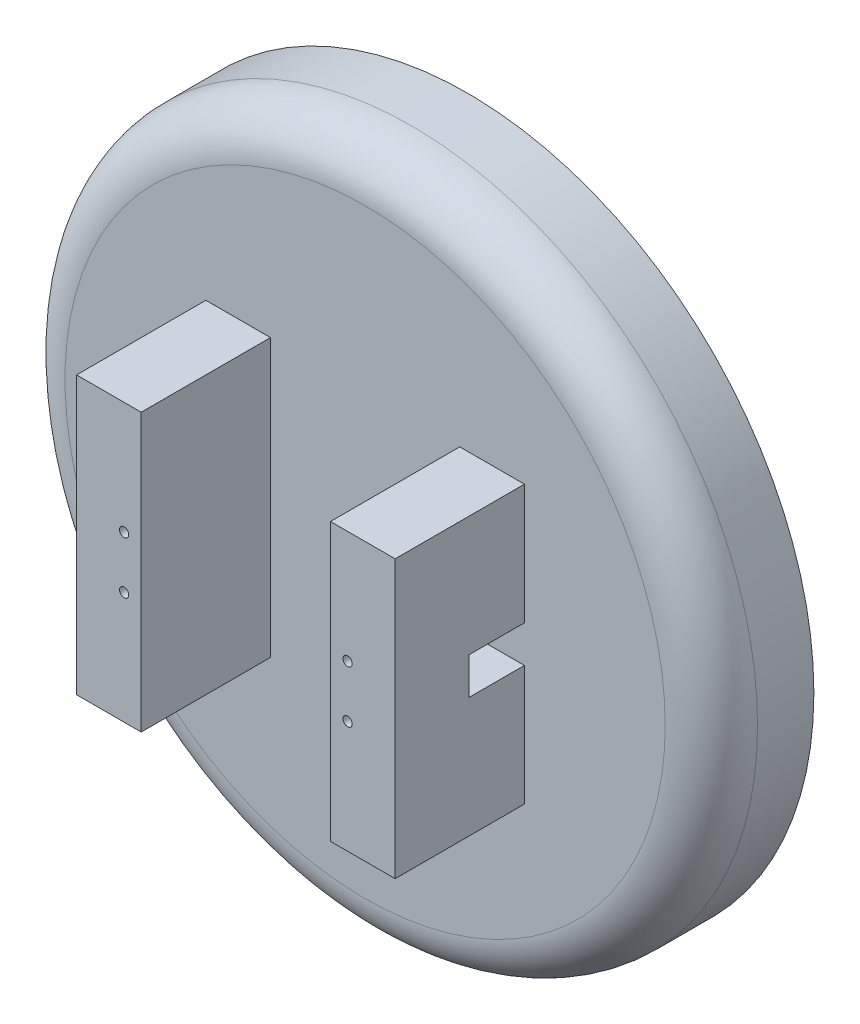
ISO-10303-21;
HEADER;
FILE_DESCRIPTION(('STEP AP214'),'2;1');
FILE_NAME('part.step','',(''),(''),'','','');
FILE_SCHEMA(('AUTOMOTIVE_DESIGN { 1 0 10303 214 1 1 1 1 }'));
ENDSEC;
DATA;
#1=APPLICATION_CONTEXT('core data for automotive mechanical design processes');
#2=APPLICATION_PROTOCOL_DEFINITION('international standard','automotive_design',2000,#1);
#3=PRODUCT_CONTEXT('',#1,'mechanical');
#4=PRODUCT('Part','Part','',(#3));
#5=PRODUCT_RELATED_PRODUCT_CATEGORY('part','',(#4));
#6=PRODUCT_DEFINITION_FORMATION('','',#4);
#7=PRODUCT_DEFINITION_CONTEXT('part definition',#1,'design');
#8=PRODUCT_DEFINITION('design','',#6,#7);
#9=PRODUCT_DEFINITION_SHAPE('','',#8);
#10=(LENGTH_UNIT() NAMED_UNIT(*) SI_UNIT(.MILLI.,.METRE.));
#11=(NAMED_UNIT(*) PLANE_ANGLE_UNIT() SI_UNIT($,.RADIAN.));
#12=(NAMED_UNIT(*) SI_UNIT($,.STERADIAN.) SOLID_ANGLE_UNIT());
#13=UNCERTAINTY_MEASURE_WITH_UNIT(LENGTH_MEASURE(1.E-05),#10,'distance_accuracy_value','');
#14=(GEOMETRIC_REPRESENTATION_CONTEXT(3) GLOBAL_UNCERTAINTY_ASSIGNED_CONTEXT((#13)) GLOBAL_UNIT_ASSIGNED_CONTEXT((#10,
#11,#12)) REPRESENTATION_CONTEXT('',''));
#15=CARTESIAN_POINT('',(0.,0.,0.));
#16=DIRECTION('',(0.,0.,1.));
#17=DIRECTION('',(1.,0.,0.));
#18=AXIS2_PLACEMENT_3D('',#15,#16,#17);
#19=CARTESIAN_POINT('',(34.5,30.,50.2));
#20=DIRECTION('',(-1.,0.,0.));
#21=DIRECTION('',(0.,-1.,0.));
#22=AXIS2_PLACEMENT_3D('',#19,#20,#21);
#23=PLANE('',#22);
#24=DIRECTION('',(0.,0.,1.));
#25=VECTOR('',#24,1.);
#26=CARTESIAN_POINT('',(34.5,4.,50.2));
#27=LINE('',#26,#25);
#28=CARTESIAN_POINT('',(34.5,4.,22.2));
#29=VERTEX_POINT('',#28);
#30=CARTESIAN_POINT('',(34.5,4.,34.2));
#31=VERTEX_POINT('',#30);
#32=EDGE_CURVE('E221',#29,#31,#27,.T.);
#33=ORIENTED_EDGE('',*,*,#32,.F.);
#34=DIRECTION('',(0.,1.,0.));
#35=VECTOR('',#34,1.);
#36=CARTESIAN_POINT('',(34.5,30.,22.2));
#37=LINE('',#36,#35);
#38=CARTESIAN_POINT('',(34.5,30.,22.2));
#39=VERTEX_POINT('',#38);
#40=EDGE_CURVE('E148',#29,#39,#37,.T.);
#41=ORIENTED_EDGE('',*,*,#40,.T.);
#42=DIRECTION('',(0.,0.,-1.));
#43=VECTOR('',#42,1.);
#44=CARTESIAN_POINT('',(34.5,30.,50.2));
#45=LINE('',#44,#43);
#46=CARTESIAN_POINT('',(34.5,30.,50.2));
#47=VERTEX_POINT('',#46);
#48=EDGE_CURVE('E166',#47,#39,#45,.T.);
#49=ORIENTED_EDGE('',*,*,#48,.F.);
#50=DIRECTION('',(0.,1.,0.));
#51=VECTOR('',#50,1.);
#52=CARTESIAN_POINT('',(34.5,30.,50.2));
#53=LINE('',#52,#51);
#54=CARTESIAN_POINT('',(34.5,-30.,50.2));
#55=VERTEX_POINT('',#54);
#56=EDGE_CURVE('E261',#55,#47,#53,.T.);
#57=ORIENTED_EDGE('',*,*,#56,.F.);
#58=DIRECTION('',(0.,0.,-1.));
#59=VECTOR('',#58,1.);
#60=CARTESIAN_POINT('',(34.5,-30.,50.2));
#61=LINE('',#60,#59);
#62=CARTESIAN_POINT('',(34.5,-30.,22.2));
#63=VERTEX_POINT('',#62);
#64=EDGE_CURVE('E145',#55,#63,#61,.T.);
#65=ORIENTED_EDGE('',*,*,#64,.T.);
#66=CARTESIAN_POINT('',(34.5,-4.,22.2));
#67=VERTEX_POINT('',#66);
#68=EDGE_CURVE('E140',#63,#67,#37,.T.);
#69=ORIENTED_EDGE('',*,*,#68,.T.);
#70=DIRECTION('',(0.,0.,-1.));
#71=VECTOR('',#70,1.);
#72=CARTESIAN_POINT('',(34.5,-4.,50.2));
#73=LINE('',#72,#71);
#74=CARTESIAN_POINT('',(34.5,-4.,34.2));
#75=VERTEX_POINT('',#74);
#76=EDGE_CURVE('E126',#75,#67,#73,.T.);
#77=ORIENTED_EDGE('',*,*,#76,.F.);
#78=DIRECTION('',(0.,-1.,0.));
#79=VECTOR('',#78,1.);
#80=CARTESIAN_POINT('',(34.5,30.,34.2));
#81=LINE('',#80,#79);
#82=EDGE_CURVE('E131',#31,#75,#81,.T.);
#83=ORIENTED_EDGE('',*,*,#82,.F.);
#84=EDGE_LOOP('',(#33,#41,#49,#57,#65,#69,#77,#83));
#85=FACE_BOUND('',#84,.T.);
#86=ADVANCED_FACE('F41',(#85),#23,.F.);
#87=CARTESIAN_POINT('',(20.5,30.,50.2));
#88=DIRECTION('',(1.,0.,0.));
#89=DIRECTION('',(0.,1.,0.));
#90=AXIS2_PLACEMENT_3D('',#87,#88,#89);
#91=PLANE('',#90);
#92=DIRECTION('',(0.,0.,-1.));
#93=VECTOR('',#92,1.);
#94=CARTESIAN_POINT('',(20.5,4.,50.2));
#95=LINE('',#94,#93);
#96=CARTESIAN_POINT('',(20.5,4.,34.2));
#97=VERTEX_POINT('',#96);
#98=CARTESIAN_POINT('',(20.5,4.,22.2));
#99=VERTEX_POINT('',#98);
#100=EDGE_CURVE('E11',#97,#99,#95,.T.);
#101=ORIENTED_EDGE('',*,*,#100,.F.);
#102=DIRECTION('',(0.,1.,0.));
#103=VECTOR('',#102,1.);
#104=CARTESIAN_POINT('',(20.5,30.,34.2));
#105=LINE('',#104,#103);
#106=CARTESIAN_POINT('',(20.5,-4.,34.2));
#107=VERTEX_POINT('',#106);
#108=EDGE_CURVE('E49',#107,#97,#105,.T.);
#109=ORIENTED_EDGE('',*,*,#108,.F.);
#110=DIRECTION('',(0.,0.,1.));
#111=VECTOR('',#110,1.);
#112=CARTESIAN_POINT('',(20.5,-4.,50.2));
#113=LINE('',#112,#111);
#114=CARTESIAN_POINT('',(20.5,-4.,22.2));
#115=VERTEX_POINT('',#114);
#116=EDGE_CURVE('E209',#115,#107,#113,.T.);
#117=ORIENTED_EDGE('',*,*,#116,.F.);
#118=DIRECTION('',(0.,-1.,0.));
#119=VECTOR('',#118,1.);
#120=CARTESIAN_POINT('',(20.5,30.,22.2));
#121=LINE('',#120,#119);
#122=CARTESIAN_POINT('',(20.5,-30.,22.2));
#123=VERTEX_POINT('',#122);
#124=EDGE_CURVE('E141',#115,#123,#121,.T.);
#125=ORIENTED_EDGE('',*,*,#124,.T.);
#126=DIRECTION('',(0.,0.,-1.));
#127=VECTOR('',#126,1.);
#128=CARTESIAN_POINT('',(20.5,-30.,50.2));
#129=LINE('',#128,#127);
#130=CARTESIAN_POINT('',(20.5,-30.,50.2));
#131=VERTEX_POINT('',#130);
#132=EDGE_CURVE('E160',#131,#123,#129,.T.);
#133=ORIENTED_EDGE('',*,*,#132,.F.);
#134=DIRECTION('',(0.,-1.,0.));
#135=VECTOR('',#134,1.);
#136=CARTESIAN_POINT('',(20.5,30.,50.2));
#137=LINE('',#136,#135);
#138=CARTESIAN_POINT('',(20.5,30.,50.2));
#139=VERTEX_POINT('',#138);
#140=EDGE_CURVE('E164',#139,#131,#137,.T.);
#141=ORIENTED_EDGE('',*,*,#140,.F.);
#142=DIRECTION('',(0.,0.,-1.));
#143=VECTOR('',#142,1.);
#144=CARTESIAN_POINT('',(20.5,30.,50.2));
#145=LINE('',#144,#143);
#146=CARTESIAN_POINT('',(20.5,30.,22.2));
#147=VERTEX_POINT('',#146);
#148=EDGE_CURVE('E163',#139,#147,#145,.T.);
#149=ORIENTED_EDGE('',*,*,#148,.T.);
#150=EDGE_CURVE('E156',#147,#99,#121,.T.);
#151=ORIENTED_EDGE('',*,*,#150,.T.);
#152=EDGE_LOOP('',(#101,#109,#117,#125,#133,#141,#149,#151));
#153=FACE_BOUND('',#152,.T.);
#154=ADVANCED_FACE('F223',(#153),#91,.F.);
#155=CARTESIAN_POINT('',(0.,0.,22.2));
#156=DIRECTION('',(0.,0.,1.));
#157=DIRECTION('',(1.,0.,0.));
#158=AXIS2_PLACEMENT_3D('',#155,#156,#157);
#159=PLANE('',#158);
#160=DIRECTION('',(-1.,0.,0.));
#161=VECTOR('',#160,1.);
#162=CARTESIAN_POINT('',(75.,4.,22.2));
#163=LINE('',#162,#161);
#164=EDGE_CURVE('E132',#29,#99,#163,.T.);
#165=ORIENTED_EDGE('',*,*,#164,.T.);
#166=ORIENTED_EDGE('',*,*,#150,.F.);
#167=DIRECTION('',(-1.,0.,0.));
#168=VECTOR('',#167,1.);
#169=CARTESIAN_POINT('',(20.5,30.,22.2));
#170=LINE('',#169,#168);
#171=EDGE_CURVE('E147',#39,#147,#170,.T.);
#172=ORIENTED_EDGE('',*,*,#171,.F.);
#173=ORIENTED_EDGE('',*,*,#40,.F.);
#174=EDGE_LOOP('',(#165,#166,#172,#173));
#175=FACE_BOUND('',#174,.T.);
#176=CARTESIAN_POINT('',(0.,0.,22.2));
#177=DIRECTION('',(0.,0.,1.));
#178=DIRECTION('',(1.,0.,0.));
#179=AXIS2_PLACEMENT_3D('',#176,#177,#178);
#180=CIRCLE('',#179,65.);
#181=CARTESIAN_POINT('',(65.,0.,22.2));
#182=VERTEX_POINT('',#181);
#183=EDGE_CURVE('E203',#182,#182,#180,.T.);
#184=ORIENTED_EDGE('',*,*,#183,.T.);
#185=EDGE_LOOP('',(#184));
#186=FACE_BOUND('',#185,.T.);
#187=DIRECTION('',(-1.,0.,0.));
#188=VECTOR('',#187,1.);
#189=CARTESIAN_POINT('',(75.,-4.,22.2));
#190=LINE('',#189,#188);
#191=EDGE_CURVE('E61',#67,#115,#190,.T.);
#192=ORIENTED_EDGE('',*,*,#191,.F.);
#193=ORIENTED_EDGE('',*,*,#68,.F.);
#194=DIRECTION('',(1.,0.,0.));
#195=VECTOR('',#194,1.);
#196=CARTESIAN_POINT('',(34.5,-30.,22.2));
#197=LINE('',#196,#195);
#198=EDGE_CURVE('E152',#123,#63,#197,.T.);
#199=ORIENTED_EDGE('',*,*,#198,.F.);
#200=ORIENTED_EDGE('',*,*,#124,.F.);
#201=EDGE_LOOP('',(#192,#193,#199,#200));
#202=FACE_BOUND('',#201,.T.);
#203=DIRECTION('',(0.,1.,0.));
#204=VECTOR('',#203,1.);
#205=CARTESIAN_POINT('',(-20.5,30.,22.2));
#206=LINE('',#205,#204);
#207=CARTESIAN_POINT('',(-20.5,-30.,22.2));
#208=VERTEX_POINT('',#207);
#209=CARTESIAN_POINT('',(-20.5,30.,22.2));
#210=VERTEX_POINT('',#209);
#211=EDGE_CURVE('E189',#208,#210,#206,.T.);
#212=ORIENTED_EDGE('',*,*,#211,.F.);
#213=DIRECTION('',(1.,0.,0.));
#214=VECTOR('',#213,1.);
#215=CARTESIAN_POINT('',(-34.5,-30.,22.2));
#216=LINE('',#215,#214);
#217=CARTESIAN_POINT('',(-34.5,-30.,22.2));
#218=VERTEX_POINT('',#217);
#219=EDGE_CURVE('E191',#218,#208,#216,.T.);
#220=ORIENTED_EDGE('',*,*,#219,.F.);
#221=DIRECTION('',(0.,-1.,0.));
#222=VECTOR('',#221,1.);
#223=CARTESIAN_POINT('',(-34.5,30.,22.2));
#224=LINE('',#223,#222);
#225=CARTESIAN_POINT('',(-34.5,30.,22.2));
#226=VERTEX_POINT('',#225);
#227=EDGE_CURVE('E183',#226,#218,#224,.T.);
#228=ORIENTED_EDGE('',*,*,#227,.F.);
#229=DIRECTION('',(-1.,0.,0.));
#230=VECTOR('',#229,1.);
#231=CARTESIAN_POINT('',(-34.5,30.,22.2));
#232=LINE('',#231,#230);
#233=EDGE_CURVE('E185',#210,#226,#232,.T.);
#234=ORIENTED_EDGE('',*,*,#233,.F.);
#235=EDGE_LOOP('',(#212,#220,#228,#234));
#236=FACE_BOUND('',#235,.T.);
#237=ADVANCED_FACE('F137',(#175,#186,#202,#236),#159,.T.);
#238=CARTESIAN_POINT('',(0.,0.,22.2));
#239=DIRECTION('',(0.,0.,-1.));
#240=DIRECTION('',(-1.,0.,0.));
#241=AXIS2_PLACEMENT_3D('',#238,#239,#240);
#242=CYLINDRICAL_SURFACE('',#241,75.);
#243=CARTESIAN_POINT('',(0.,0.,12.2));
#244=DIRECTION('',(0.,0.,1.));
#245=DIRECTION('',(1.,0.,0.));
#246=AXIS2_PLACEMENT_3D('',#243,#244,#245);
#247=CIRCLE('',#246,75.);
#248=CARTESIAN_POINT('',(75.,0.,12.2));
#249=VERTEX_POINT('',#248);
#250=EDGE_CURVE('E206',#249,#249,#247,.F.);
#251=ORIENTED_EDGE('',*,*,#250,.T.);
#252=EDGE_LOOP('',(#251));
#253=FACE_BOUND('',#252,.T.);
#254=CARTESIAN_POINT('',(0.,0.,0.));
#255=DIRECTION('',(0.,0.,1.));
#256=DIRECTION('',(1.,0.,0.));
#257=AXIS2_PLACEMENT_3D('',#254,#255,#256);
#258=CIRCLE('',#257,75.);
#259=CARTESIAN_POINT('',(75.,0.,0.));
#260=VERTEX_POINT('',#259);
#261=EDGE_CURVE('E170',#260,#260,#258,.T.);
#262=ORIENTED_EDGE('',*,*,#261,.T.);
#263=EDGE_LOOP('',(#262));
#264=FACE_BOUND('',#263,.T.);
#265=ADVANCED_FACE('F362',(#253,#264),#242,.T.);
#266=CARTESIAN_POINT('',(0.,0.,0.));
#267=DIRECTION('',(0.,0.,1.));
#268=DIRECTION('',(1.,0.,0.));
#269=AXIS2_PLACEMENT_3D('',#266,#267,#268);
#270=PLANE('',#269);
#271=ORIENTED_EDGE('',*,*,#261,.F.);
#272=EDGE_LOOP('',(#271));
#273=FACE_BOUND('',#272,.T.);
#274=ADVANCED_FACE('F354',(#273),#270,.F.);
#275=CARTESIAN_POINT('',(0.,0.,12.2));
#276=DIRECTION('',(0.,0.,1.));
#277=DIRECTION('',(1.,0.,0.));
#278=AXIS2_PLACEMENT_3D('',#275,#276,#277);
#279=TOROIDAL_SURFACE('',#278,65.,10.);
#280=ORIENTED_EDGE('',*,*,#250,.F.);
#281=EDGE_LOOP('',(#280));
#282=FACE_BOUND('',#281,.T.);
#283=ORIENTED_EDGE('',*,*,#183,.F.);
#284=EDGE_LOOP('',(#283));
#285=FACE_BOUND('',#284,.T.);
#286=ADVANCED_FACE('F43',(#282,#285),#279,.T.);
#287=CARTESIAN_POINT('',(-34.5,-30.,50.2));
#288=DIRECTION('',(0.,1.,0.));
#289=DIRECTION('',(0.,0.,1.));
#290=AXIS2_PLACEMENT_3D('',#287,#288,#289);
#291=PLANE('',#290);
#292=ORIENTED_EDGE('',*,*,#219,.T.);
#293=DIRECTION('',(0.,0.,-1.));
#294=VECTOR('',#293,1.);
#295=CARTESIAN_POINT('',(-20.5,-30.,50.2));
#296=LINE('',#295,#294);
#297=CARTESIAN_POINT('',(-20.5,-30.,50.2));
#298=VERTEX_POINT('',#297);
#299=EDGE_CURVE('E171',#298,#208,#296,.T.);
#300=ORIENTED_EDGE('',*,*,#299,.F.);
#301=DIRECTION('',(1.,0.,0.));
#302=VECTOR('',#301,1.);
#303=CARTESIAN_POINT('',(-34.5,-30.,50.2));
#304=LINE('',#303,#302);
#305=CARTESIAN_POINT('',(-34.5,-30.,50.2));
#306=VERTEX_POINT('',#305);
#307=EDGE_CURVE('E186',#306,#298,#304,.T.);
#308=ORIENTED_EDGE('',*,*,#307,.F.);
#309=DIRECTION('',(0.,0.,-1.));
#310=VECTOR('',#309,1.);
#311=CARTESIAN_POINT('',(-34.5,-30.,50.2));
#312=LINE('',#311,#310);
#313=EDGE_CURVE('E179',#306,#218,#312,.T.);
#314=ORIENTED_EDGE('',*,*,#313,.T.);
#315=EDGE_LOOP('',(#292,#300,#308,#314));
#316=FACE_BOUND('',#315,.T.);
#317=ADVANCED_FACE('F353',(#316),#291,.F.);
#318=CARTESIAN_POINT('',(-20.5,30.,50.2));
#319=DIRECTION('',(-1.,0.,0.));
#320=DIRECTION('',(0.,-1.,0.));
#321=AXIS2_PLACEMENT_3D('',#318,#319,#320);
#322=PLANE('',#321);
#323=ORIENTED_EDGE('',*,*,#211,.T.);
#324=DIRECTION('',(0.,0.,-1.));
#325=VECTOR('',#324,1.);
#326=CARTESIAN_POINT('',(-20.5,30.,50.2));
#327=LINE('',#326,#325);
#328=CARTESIAN_POINT('',(-20.5,30.,50.2));
#329=VERTEX_POINT('',#328);
#330=EDGE_CURVE('E173',#329,#210,#327,.T.);
#331=ORIENTED_EDGE('',*,*,#330,.F.);
#332=DIRECTION('',(0.,1.,0.));
#333=VECTOR('',#332,1.);
#334=CARTESIAN_POINT('',(-20.5,30.,50.2));
#335=LINE('',#334,#333);
#336=EDGE_CURVE('E197',#298,#329,#335,.T.);
#337=ORIENTED_EDGE('',*,*,#336,.F.);
#338=ORIENTED_EDGE('',*,*,#299,.T.);
#339=EDGE_LOOP('',(#323,#331,#337,#338));
#340=FACE_BOUND('',#339,.T.);
#341=ADVANCED_FACE('F451',(#340),#322,.F.);
#342=CARTESIAN_POINT('',(-34.5,30.,50.2));
#343=DIRECTION('',(0.,-1.,0.));
#344=DIRECTION('',(0.,0.,-1.));
#345=AXIS2_PLACEMENT_3D('',#342,#343,#344);
#346=PLANE('',#345);
#347=ORIENTED_EDGE('',*,*,#233,.T.);
#348=DIRECTION('',(0.,0.,-1.));
#349=VECTOR('',#348,1.);
#350=CARTESIAN_POINT('',(-34.5,30.,50.2));
#351=LINE('',#350,#349);
#352=CARTESIAN_POINT('',(-34.5,30.,50.2));
#353=VERTEX_POINT('',#352);
#354=EDGE_CURVE('E177',#353,#226,#351,.T.);
#355=ORIENTED_EDGE('',*,*,#354,.F.);
#356=DIRECTION('',(-1.,0.,0.));
#357=VECTOR('',#356,1.);
#358=CARTESIAN_POINT('',(-34.5,30.,50.2));
#359=LINE('',#358,#357);
#360=EDGE_CURVE('E195',#329,#353,#359,.T.);
#361=ORIENTED_EDGE('',*,*,#360,.F.);
#362=ORIENTED_EDGE('',*,*,#330,.T.);
#363=EDGE_LOOP('',(#347,#355,#361,#362));
#364=FACE_BOUND('',#363,.T.);
#365=ADVANCED_FACE('F442',(#364),#346,.F.);
#366=CARTESIAN_POINT('',(-34.5,30.,50.2));
#367=DIRECTION('',(1.,0.,0.));
#368=DIRECTION('',(0.,1.,0.));
#369=AXIS2_PLACEMENT_3D('',#366,#367,#368);
#370=PLANE('',#369);
#371=ORIENTED_EDGE('',*,*,#227,.T.);
#372=ORIENTED_EDGE('',*,*,#313,.F.);
#373=DIRECTION('',(0.,-1.,0.));
#374=VECTOR('',#373,1.);
#375=CARTESIAN_POINT('',(-34.5,30.,50.2));
#376=LINE('',#375,#374);
#377=EDGE_CURVE('E182',#353,#306,#376,.T.);
#378=ORIENTED_EDGE('',*,*,#377,.F.);
#379=ORIENTED_EDGE('',*,*,#354,.T.);
#380=EDGE_LOOP('',(#371,#372,#378,#379));
#381=FACE_BOUND('',#380,.T.);
#382=ADVANCED_FACE('F282',(#381),#370,.F.);
#383=CARTESIAN_POINT('',(0.,0.,50.2));
#384=DIRECTION('',(0.,0.,-1.));
#385=DIRECTION('',(-1.,0.,0.));
#386=AXIS2_PLACEMENT_3D('',#383,#384,#385);
#387=PLANE('',#386);
#388=CARTESIAN_POINT('',(-24.2,-5.65,50.2));
#389=DIRECTION('',(0.,0.,1.));
#390=DIRECTION('',(-1.,0.,0.));
#391=AXIS2_PLACEMENT_3D('',#388,#389,#390);
#392=CIRCLE('',#391,1.);
#393=CARTESIAN_POINT('',(-25.2,-5.65,50.2));
#394=VERTEX_POINT('',#393);
#395=EDGE_CURVE('E237',#394,#394,#392,.T.);
#396=ORIENTED_EDGE('',*,*,#395,.F.);
#397=EDGE_LOOP('',(#396));
#398=FACE_BOUND('',#397,.T.);
#399=CARTESIAN_POINT('',(-24.2,5.65,50.2));
#400=DIRECTION('',(0.,0.,1.));
#401=DIRECTION('',(1.,0.,0.));
#402=AXIS2_PLACEMENT_3D('',#399,#400,#401);
#403=CIRCLE('',#402,1.);
#404=CARTESIAN_POINT('',(-23.2,5.65,50.2));
#405=VERTEX_POINT('',#404);
#406=EDGE_CURVE('E240',#405,#405,#403,.T.);
#407=ORIENTED_EDGE('',*,*,#406,.F.);
#408=EDGE_LOOP('',(#407));
#409=FACE_BOUND('',#408,.T.);
#410=ORIENTED_EDGE('',*,*,#307,.T.);
#411=ORIENTED_EDGE('',*,*,#336,.T.);
#412=ORIENTED_EDGE('',*,*,#360,.T.);
#413=ORIENTED_EDGE('',*,*,#377,.T.);
#414=EDGE_LOOP('',(#410,#411,#412,#413));
#415=FACE_BOUND('',#414,.T.);
#416=ADVANCED_FACE('F273',(#398,#409,#415),#387,.F.);
#417=CARTESIAN_POINT('',(34.5,-30.,50.2));
#418=DIRECTION('',(0.,1.,0.));
#419=DIRECTION('',(0.,0.,1.));
#420=AXIS2_PLACEMENT_3D('',#417,#418,#419);
#421=PLANE('',#420);
#422=ORIENTED_EDGE('',*,*,#198,.T.);
#423=ORIENTED_EDGE('',*,*,#64,.F.);
#424=DIRECTION('',(1.,0.,0.));
#425=VECTOR('',#424,1.);
#426=CARTESIAN_POINT('',(34.5,-30.,50.2));
#427=LINE('',#426,#425);
#428=EDGE_CURVE('E159',#131,#55,#427,.T.);
#429=ORIENTED_EDGE('',*,*,#428,.F.);
#430=ORIENTED_EDGE('',*,*,#132,.T.);
#431=EDGE_LOOP('',(#422,#423,#429,#430));
#432=FACE_BOUND('',#431,.T.);
#433=ADVANCED_FACE('F270',(#432),#421,.F.);
#434=CARTESIAN_POINT('',(20.5,30.,50.2));
#435=DIRECTION('',(0.,-1.,0.));
#436=DIRECTION('',(0.,0.,-1.));
#437=AXIS2_PLACEMENT_3D('',#434,#435,#436);
#438=PLANE('',#437);
#439=ORIENTED_EDGE('',*,*,#171,.T.);
#440=ORIENTED_EDGE('',*,*,#148,.F.);
#441=DIRECTION('',(-1.,0.,0.));
#442=VECTOR('',#441,1.);
#443=CARTESIAN_POINT('',(20.5,30.,50.2));
#444=LINE('',#443,#442);
#445=EDGE_CURVE('E263',#47,#139,#444,.T.);
#446=ORIENTED_EDGE('',*,*,#445,.F.);
#447=ORIENTED_EDGE('',*,*,#48,.T.);
#448=EDGE_LOOP('',(#439,#440,#446,#447));
#449=FACE_BOUND('',#448,.T.);
#450=ADVANCED_FACE('F272',(#449),#438,.F.);
#451=CARTESIAN_POINT('',(0.,0.,50.2));
#452=DIRECTION('',(0.,0.,1.));
#453=DIRECTION('',(1.,0.,0.));
#454=AXIS2_PLACEMENT_3D('',#451,#452,#453);
#455=PLANE('',#454);
#456=CARTESIAN_POINT('',(24.2,5.64999999999999,50.2));
#457=DIRECTION('',(0.,0.,1.));
#458=DIRECTION('',(-1.,0.,0.));
#459=AXIS2_PLACEMENT_3D('',#456,#457,#458);
#460=CIRCLE('',#459,1.);
#461=CARTESIAN_POINT('',(23.2,5.64999999999999,50.2));
#462=VERTEX_POINT('',#461);
#463=EDGE_CURVE('E250',#462,#462,#460,.T.);
#464=ORIENTED_EDGE('',*,*,#463,.F.);
#465=EDGE_LOOP('',(#464));
#466=FACE_BOUND('',#465,.T.);
#467=CARTESIAN_POINT('',(24.2,-5.65,50.2));
#468=DIRECTION('',(0.,0.,1.));
#469=DIRECTION('',(1.,0.,0.));
#470=AXIS2_PLACEMENT_3D('',#467,#468,#469);
#471=CIRCLE('',#470,1.);
#472=CARTESIAN_POINT('',(25.2,-5.65,50.2));
#473=VERTEX_POINT('',#472);
#474=EDGE_CURVE('E244',#473,#473,#471,.T.);
#475=ORIENTED_EDGE('',*,*,#474,.F.);
#476=EDGE_LOOP('',(#475));
#477=FACE_BOUND('',#476,.T.);
#478=ORIENTED_EDGE('',*,*,#428,.T.);
#479=ORIENTED_EDGE('',*,*,#56,.T.);
#480=ORIENTED_EDGE('',*,*,#445,.T.);
#481=ORIENTED_EDGE('',*,*,#140,.T.);
#482=EDGE_LOOP('',(#478,#479,#480,#481));
#483=FACE_BOUND('',#482,.T.);
#484=ADVANCED_FACE('F266',(#466,#477,#483),#455,.T.);
#485=CARTESIAN_POINT('',(24.2,-5.65,40.2));
#486=DIRECTION('',(0.,0.,1.));
#487=DIRECTION('',(1.,0.,0.));
#488=AXIS2_PLACEMENT_3D('',#485,#486,#487);
#489=CYLINDRICAL_SURFACE('',#488,1.);
#490=CARTESIAN_POINT('',(24.2,-5.65,40.2));
#491=DIRECTION('',(0.,0.,1.));
#492=DIRECTION('',(1.,0.,0.));
#493=AXIS2_PLACEMENT_3D('',#490,#491,#492);
#494=CIRCLE('',#493,1.);
#495=CARTESIAN_POINT('',(25.2,-5.65,40.2));
#496=VERTEX_POINT('',#495);
#497=EDGE_CURVE('E247',#496,#496,#494,.T.);
#498=ORIENTED_EDGE('',*,*,#497,.F.);
#499=EDGE_LOOP('',(#498));
#500=FACE_BOUND('',#499,.T.);
#501=ORIENTED_EDGE('',*,*,#474,.T.);
#502=EDGE_LOOP('',(#501));
#503=FACE_BOUND('',#502,.T.);
#504=ADVANCED_FACE('F296',(#500,#503),#489,.F.);
#505=CARTESIAN_POINT('',(24.2,-5.65,40.2));
#506=DIRECTION('',(0.,0.,1.));
#507=DIRECTION('',(1.,0.,0.));
#508=AXIS2_PLACEMENT_3D('',#505,#506,#507);
#509=PLANE('',#508);
#510=ORIENTED_EDGE('',*,*,#497,.T.);
#511=EDGE_LOOP('',(#510));
#512=FACE_BOUND('',#511,.T.);
#513=ADVANCED_FACE('F314',(#512),#509,.T.);
#514=CARTESIAN_POINT('',(24.2,5.64999999999999,40.2));
#515=DIRECTION('',(0.,0.,1.));
#516=DIRECTION('',(1.,0.,0.));
#517=AXIS2_PLACEMENT_3D('',#514,#515,#516);
#518=CYLINDRICAL_SURFACE('',#517,1.);
#519=CARTESIAN_POINT('',(24.2,5.64999999999999,40.2));
#520=DIRECTION('',(0.,0.,1.));
#521=DIRECTION('',(-1.,0.,0.));
#522=AXIS2_PLACEMENT_3D('',#519,#520,#521);
#523=CIRCLE('',#522,1.);
#524=CARTESIAN_POINT('',(23.2,5.64999999999999,40.2));
#525=VERTEX_POINT('',#524);
#526=EDGE_CURVE('E236',#525,#525,#523,.T.);
#527=ORIENTED_EDGE('',*,*,#526,.F.);
#528=EDGE_LOOP('',(#527));
#529=FACE_BOUND('',#528,.T.);
#530=ORIENTED_EDGE('',*,*,#463,.T.);
#531=EDGE_LOOP('',(#530));
#532=FACE_BOUND('',#531,.T.);
#533=ADVANCED_FACE('F310',(#529,#532),#518,.F.);
#534=CARTESIAN_POINT('',(24.2,5.64999999999999,40.2));
#535=DIRECTION('',(0.,0.,-1.));
#536=DIRECTION('',(-1.,0.,0.));
#537=AXIS2_PLACEMENT_3D('',#534,#535,#536);
#538=PLANE('',#537);
#539=ORIENTED_EDGE('',*,*,#526,.T.);
#540=EDGE_LOOP('',(#539));
#541=FACE_BOUND('',#540,.T.);
#542=ADVANCED_FACE('F302',(#541),#538,.F.);
#543=CARTESIAN_POINT('',(-24.2,5.65,40.2));
#544=DIRECTION('',(0.,0.,1.));
#545=DIRECTION('',(1.,0.,0.));
#546=AXIS2_PLACEMENT_3D('',#543,#544,#545);
#547=CYLINDRICAL_SURFACE('',#546,1.);
#548=CARTESIAN_POINT('',(-24.2,5.65,40.2));
#549=DIRECTION('',(0.,0.,1.));
#550=DIRECTION('',(1.,0.,0.));
#551=AXIS2_PLACEMENT_3D('',#548,#549,#550);
#552=CIRCLE('',#551,1.);
#553=CARTESIAN_POINT('',(-23.2,5.65,40.2));
#554=VERTEX_POINT('',#553);
#555=EDGE_CURVE('E174',#554,#554,#552,.T.);
#556=ORIENTED_EDGE('',*,*,#555,.F.);
#557=EDGE_LOOP('',(#556));
#558=FACE_BOUND('',#557,.T.);
#559=ORIENTED_EDGE('',*,*,#406,.T.);
#560=EDGE_LOOP('',(#559));
#561=FACE_BOUND('',#560,.T.);
#562=ADVANCED_FACE('F298',(#558,#561),#547,.F.);
#563=CARTESIAN_POINT('',(-24.2,5.65,40.2));
#564=DIRECTION('',(0.,0.,1.));
#565=DIRECTION('',(1.,0.,0.));
#566=AXIS2_PLACEMENT_3D('',#563,#564,#565);
#567=PLANE('',#566);
#568=ORIENTED_EDGE('',*,*,#555,.T.);
#569=EDGE_LOOP('',(#568));
#570=FACE_BOUND('',#569,.T.);
#571=ADVANCED_FACE('F301',(#570),#567,.T.);
#572=CARTESIAN_POINT('',(-24.2,-5.65,40.2));
#573=DIRECTION('',(0.,0.,1.));
#574=DIRECTION('',(1.,0.,0.));
#575=AXIS2_PLACEMENT_3D('',#572,#573,#574);
#576=CYLINDRICAL_SURFACE('',#575,1.);
#577=CARTESIAN_POINT('',(-24.2,-5.65,40.2));
#578=DIRECTION('',(0.,0.,1.));
#579=DIRECTION('',(-1.,0.,0.));
#580=AXIS2_PLACEMENT_3D('',#577,#578,#579);
#581=CIRCLE('',#580,1.);
#582=CARTESIAN_POINT('',(-25.2,-5.65,40.2));
#583=VERTEX_POINT('',#582);
#584=EDGE_CURVE('E241',#583,#583,#581,.T.);
#585=ORIENTED_EDGE('',*,*,#584,.F.);
#586=EDGE_LOOP('',(#585));
#587=FACE_BOUND('',#586,.T.);
#588=ORIENTED_EDGE('',*,*,#395,.T.);
#589=EDGE_LOOP('',(#588));
#590=FACE_BOUND('',#589,.T.);
#591=ADVANCED_FACE('F306',(#587,#590),#576,.F.);
#592=CARTESIAN_POINT('',(-24.2,-5.65,40.2));
#593=DIRECTION('',(0.,0.,-1.));
#594=DIRECTION('',(-1.,0.,0.));
#595=AXIS2_PLACEMENT_3D('',#592,#593,#594);
#596=PLANE('',#595);
#597=ORIENTED_EDGE('',*,*,#584,.T.);
#598=EDGE_LOOP('',(#597));
#599=FACE_BOUND('',#598,.T.);
#600=ADVANCED_FACE('F322',(#599),#596,.F.);
#601=CARTESIAN_POINT('',(75.,4.,22.2));
#602=DIRECTION('',(0.,-1.,0.));
#603=DIRECTION('',(0.,0.,-1.));
#604=AXIS2_PLACEMENT_3D('',#601,#602,#603);
#605=PLANE('',#604);
#606=ORIENTED_EDGE('',*,*,#32,.T.);
#607=DIRECTION('',(-1.,0.,0.));
#608=VECTOR('',#607,1.);
#609=CARTESIAN_POINT('',(75.,4.,34.2));
#610=LINE('',#609,#608);
#611=EDGE_CURVE('E215',#31,#97,#610,.T.);
#612=ORIENTED_EDGE('',*,*,#611,.T.);
#613=ORIENTED_EDGE('',*,*,#100,.T.);
#614=ORIENTED_EDGE('',*,*,#164,.F.);
#615=EDGE_LOOP('',(#606,#612,#613,#614));
#616=FACE_BOUND('',#615,.T.);
#617=ADVANCED_FACE('F219',(#616),#605,.T.);
#618=CARTESIAN_POINT('',(75.,-4.,34.2));
#619=DIRECTION('',(0.,0.,-1.));
#620=DIRECTION('',(-1.,0.,0.));
#621=AXIS2_PLACEMENT_3D('',#618,#619,#620);
#622=PLANE('',#621);
#623=ORIENTED_EDGE('',*,*,#82,.T.);
#624=DIRECTION('',(-1.,0.,0.));
#625=VECTOR('',#624,1.);
#626=CARTESIAN_POINT('',(75.,-4.,34.2));
#627=LINE('',#626,#625);
#628=EDGE_CURVE('E56',#75,#107,#627,.T.);
#629=ORIENTED_EDGE('',*,*,#628,.T.);
#630=ORIENTED_EDGE('',*,*,#108,.T.);
#631=ORIENTED_EDGE('',*,*,#611,.F.);
#632=EDGE_LOOP('',(#623,#629,#630,#631));
#633=FACE_BOUND('',#632,.T.);
#634=ADVANCED_FACE('F214',(#633),#622,.T.);
#635=CARTESIAN_POINT('',(75.,-4.,22.2));
#636=DIRECTION('',(0.,1.,0.));
#637=DIRECTION('',(0.,0.,1.));
#638=AXIS2_PLACEMENT_3D('',#635,#636,#637);
#639=PLANE('',#638);
#640=ORIENTED_EDGE('',*,*,#76,.T.);
#641=ORIENTED_EDGE('',*,*,#191,.T.);
#642=ORIENTED_EDGE('',*,*,#116,.T.);
#643=ORIENTED_EDGE('',*,*,#628,.F.);
#644=EDGE_LOOP('',(#640,#641,#642,#643));
#645=FACE_BOUND('',#644,.T.);
#646=ADVANCED_FACE('F127',(#645),#639,.T.);
#647=CLOSED_SHELL('',(#86,#154,#237,#265,#274,#286,#317,#341,#365,#382,#416,#433,#450,#484,#504,
#513,#533,#542,#562,#571,#591,#600,#617,#634,#646));
#648=MANIFOLD_SOLID_BREP('B2',#647);
#649=ADVANCED_BREP_SHAPE_REPRESENTATION('',(#18,#648),#14);
#650=SHAPE_DEFINITION_REPRESENTATION(#9,#649);
ENDSEC;
END-ISO-10303-21;
